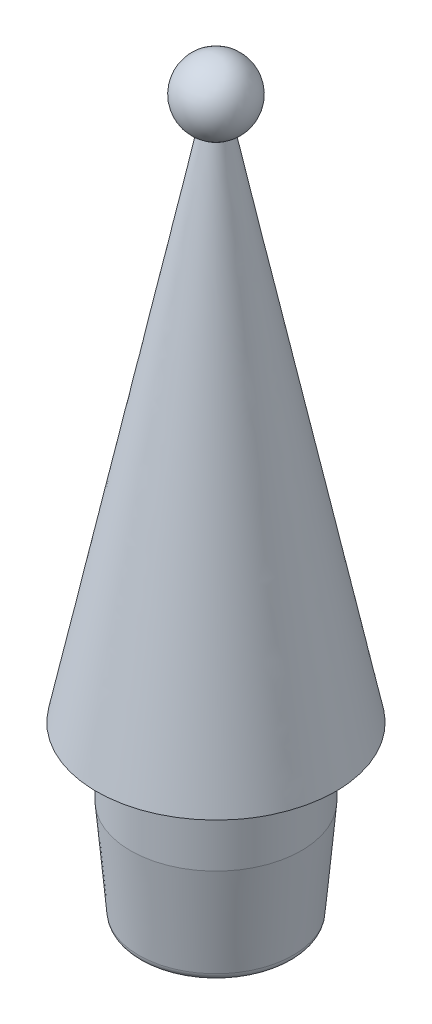
ISO-10303-21;
HEADER;
FILE_DESCRIPTION(('STEP AP214'),'2;1');
FILE_NAME('part.step','',(''),(''),'','','');
FILE_SCHEMA(('AUTOMOTIVE_DESIGN { 1 0 10303 214 1 1 1 1 }'));
ENDSEC;
DATA;
#1=APPLICATION_CONTEXT('core data for automotive mechanical design processes');
#2=APPLICATION_PROTOCOL_DEFINITION('international standard','automotive_design',2000,#1);
#3=PRODUCT_CONTEXT('',#1,'mechanical');
#4=PRODUCT('Part','Part','',(#3));
#5=PRODUCT_RELATED_PRODUCT_CATEGORY('part','',(#4));
#6=PRODUCT_DEFINITION_FORMATION('','',#4);
#7=PRODUCT_DEFINITION_CONTEXT('part definition',#1,'design');
#8=PRODUCT_DEFINITION('design','',#6,#7);
#9=PRODUCT_DEFINITION_SHAPE('','',#8);
#10=(LENGTH_UNIT() NAMED_UNIT(*) SI_UNIT(.MILLI.,.METRE.));
#11=(NAMED_UNIT(*) PLANE_ANGLE_UNIT() SI_UNIT($,.RADIAN.));
#12=(NAMED_UNIT(*) SI_UNIT($,.STERADIAN.) SOLID_ANGLE_UNIT());
#13=UNCERTAINTY_MEASURE_WITH_UNIT(LENGTH_MEASURE(1.E-05),#10,'distance_accuracy_value','');
#14=(GEOMETRIC_REPRESENTATION_CONTEXT(3) GLOBAL_UNCERTAINTY_ASSIGNED_CONTEXT((#13)) GLOBAL_UNIT_ASSIGNED_CONTEXT((#10,
#11,#12)) REPRESENTATION_CONTEXT('',''));
#15=CARTESIAN_POINT('',(0.,0.,0.));
#16=DIRECTION('',(0.,0.,1.));
#17=DIRECTION('',(1.,0.,0.));
#18=AXIS2_PLACEMENT_3D('',#15,#16,#17);
#19=CARTESIAN_POINT('',(0.,5.,0.));
#20=DIRECTION('',(0.,-1.,0.));
#21=DIRECTION('',(0.,0.,-1.));
#22=AXIS2_PLACEMENT_3D('',#19,#20,#21);
#23=CYLINDRICAL_SURFACE('',#22,2.5);
#24=CARTESIAN_POINT('',(0.,4.75,0.));
#25=DIRECTION('',(0.,1.,0.));
#26=DIRECTION('',(0.,0.,1.));
#27=AXIS2_PLACEMENT_3D('',#24,#25,#26);
#28=CIRCLE('',#27,2.5);
#29=CARTESIAN_POINT('',(0.,4.75,2.5));
#30=VERTEX_POINT('',#29);
#31=EDGE_CURVE('E65',#30,#30,#28,.F.);
#32=ORIENTED_EDGE('',*,*,#31,.T.);
#33=EDGE_LOOP('',(#32));
#34=FACE_BOUND('',#33,.T.);
#35=CARTESIAN_POINT('',(0.,3.00000000000018,0.));
#36=DIRECTION('',(0.,1.,0.));
#37=DIRECTION('',(0.,0.,1.));
#38=AXIS2_PLACEMENT_3D('',#35,#36,#37);
#39=CIRCLE('',#38,2.5);
#40=CARTESIAN_POINT('',(0.,3.00000000000018,2.5));
#41=VERTEX_POINT('',#40);
#42=EDGE_CURVE('E71',#41,#41,#39,.T.);
#43=ORIENTED_EDGE('',*,*,#42,.T.);
#44=EDGE_LOOP('',(#43));
#45=FACE_BOUND('',#44,.T.);
#46=ADVANCED_FACE('F39',(#34,#45),#23,.T.);
#47=CARTESIAN_POINT('',(0.,0.,0.));
#48=DIRECTION('',(0.,1.,0.));
#49=DIRECTION('',(0.,0.,1.));
#50=AXIS2_PLACEMENT_3D('',#47,#48,#49);
#51=PLANE('',#50);
#52=CARTESIAN_POINT('',(0.,0.,0.));
#53=DIRECTION('',(0.,1.,0.));
#54=DIRECTION('',(0.,0.,1.));
#55=AXIS2_PLACEMENT_3D('',#52,#53,#54);
#56=CIRCLE('',#55,1.61642219370202);
#57=CARTESIAN_POINT('',(0.,0.,1.61642219370202));
#58=VERTEX_POINT('',#57);
#59=EDGE_CURVE('E59',#58,#58,#56,.T.);
#60=ORIENTED_EDGE('',*,*,#59,.T.);
#61=EDGE_LOOP('',(#60));
#62=FACE_BOUND('',#61,.T.);
#63=CARTESIAN_POINT('',(0.,0.,0.));
#64=DIRECTION('',(0.,1.,0.));
#65=DIRECTION('',(0.,0.,1.));
#66=AXIS2_PLACEMENT_3D('',#63,#64,#65);
#67=CIRCLE('',#66,2.00845121591786);
#68=CARTESIAN_POINT('',(0.,0.,2.00845121591786));
#69=VERTEX_POINT('',#68);
#70=EDGE_CURVE('E62',#69,#69,#67,.F.);
#71=ORIENTED_EDGE('',*,*,#70,.T.);
#72=EDGE_LOOP('',(#71));
#73=FACE_BOUND('',#72,.T.);
#74=ADVANCED_FACE('F105',(#62,#73),#51,.F.);
#75=CARTESIAN_POINT('',(0.,5.,0.));
#76=DIRECTION('',(0.,1.,0.));
#77=DIRECTION('',(0.,0.,1.));
#78=AXIS2_PLACEMENT_3D('',#75,#76,#77);
#79=PLANE('',#78);
#80=CARTESIAN_POINT('',(0.,5.,0.));
#81=DIRECTION('',(0.,1.,0.));
#82=DIRECTION('',(0.,0.,1.));
#83=AXIS2_PLACEMENT_3D('',#80,#81,#82);
#84=CIRCLE('',#83,2.75);
#85=CARTESIAN_POINT('',(0.,5.,2.75));
#86=VERTEX_POINT('',#85);
#87=EDGE_CURVE('E68',#86,#86,#84,.T.);
#88=ORIENTED_EDGE('',*,*,#87,.T.);
#89=EDGE_LOOP('',(#88));
#90=FACE_BOUND('',#89,.T.);
#91=CARTESIAN_POINT('',(0.,5.,0.));
#92=DIRECTION('',(0.,1.,0.));
#93=DIRECTION('',(0.,0.,1.));
#94=AXIS2_PLACEMENT_3D('',#91,#92,#93);
#95=CIRCLE('',#94,3.5);
#96=CARTESIAN_POINT('',(-3.36347141619186,5.,-0.9680186116291));
#97=VERTEX_POINT('',#96);
#98=EDGE_CURVE('E77',#97,#97,#95,.T.);
#99=ORIENTED_EDGE('',*,*,#98,.F.);
#100=EDGE_LOOP('',(#99));
#101=FACE_BOUND('',#100,.T.);
#102=ADVANCED_FACE('F111',(#90,#101),#79,.F.);
#103=CARTESIAN_POINT('',(-0.353623785837754,20.,-0.18694977424371));
#104=CARTESIAN_POINT('',(-3.36347141619186,5.,-0.9680186116291));
#105=CARTESIAN_POINT('',(0.0202757626496648,20.,-0.894197345919219));
#106=CARTESIAN_POINT('',(-1.42743419293366,5.,-7.69496144401282));
#107=CARTESIAN_POINT('',(0.727523334325174,20.,-0.520297797431799));
#108=CARTESIAN_POINT('',(5.29950863945006,5.,-5.75892422075462));
#109=CARTESIAN_POINT('',(0.353623785837755,20.,0.18694977424371));
#110=CARTESIAN_POINT('',(3.36347141619186,5.,0.9680186116291));
#111=CARTESIAN_POINT('',(-0.0202757626496647,20.,0.894197345919219));
#112=CARTESIAN_POINT('',(1.42743419293366,5.,7.69496144401282));
#113=CARTESIAN_POINT('',(-0.727523334325174,20.,0.520297797431799));
#114=CARTESIAN_POINT('',(-5.29950863945006,5.,5.75892422075462));
#115=CARTESIAN_POINT('',(-0.353623785837754,20.,-0.18694977424371));
#116=CARTESIAN_POINT('',(-3.36347141619186,5.,-0.9680186116291));
#117=(BOUNDED_SURFACE() B_SPLINE_SURFACE(3,1,((#103,#104),(#105,#106),(#107,#108),(#109,#110),
(#111,#112),(#113,#114),(#115,#116)),.UNSPECIFIED.,.T.,.F.,.F.) B_SPLINE_SURFACE_WITH_KNOTS((4,
3,4),(2,2),(0.,0.5,1.),(0.,1.),
.UNSPECIFIED.) GEOMETRIC_REPRESENTATION_ITEM() RATIONAL_B_SPLINE_SURFACE(((1.,1.),
(0.333333333333333,0.333333333333333),(0.333333333333333,0.333333333333333),(1.,1.),
(0.333333333333333,0.333333333333333),(0.333333333333333,0.333333333333333),(1.,1.))) REPRESENTATION_ITEM('') SURFACE());
#118=CARTESIAN_POINT('',(0.,20.,0.));
#119=DIRECTION('',(0.,1.,0.));
#120=DIRECTION('',(0.,0.,1.));
#121=AXIS2_PLACEMENT_3D('',#118,#119,#120);
#122=CIRCLE('',#121,0.4);
#123=CARTESIAN_POINT('',(-0.353623785837754,20.,-0.18694977424371));
#124=VERTEX_POINT('',#123);
#125=EDGE_CURVE('E80',#124,#124,#122,.T.);
#126=CARTESIAN_POINT('',(-0.353623785837754,20.,-0.18694977424371));
#127=CARTESIAN_POINT('',(-0.38497636532061,19.84375,-0.195085907966474));
#128=CARTESIAN_POINT('',(-0.416328944803465,19.6875,-0.203222041689239));
#129=CARTESIAN_POINT('',(-0.479034103769175,19.375,-0.219494309134768));
#130=CARTESIAN_POINT('',(-0.510386683252031,19.21875,-0.227630442857532));
#131=CARTESIAN_POINT('',(-0.573091842217741,18.90625,-0.243902710303061));
#132=CARTESIAN_POINT('',(-0.604444421700596,18.75,-0.252038844025825));
#133=CARTESIAN_POINT('',(-0.667149580666307,18.4375,-0.268311111471354));
#134=CARTESIAN_POINT('',(-0.698502160149162,18.28125,-0.276447245194119));
#135=CARTESIAN_POINT('',(-0.761207319114873,17.96875,-0.292719512639648));
#136=CARTESIAN_POINT('',(-0.792559898597728,17.8125,-0.300855646362412));
#137=CARTESIAN_POINT('',(-0.855265057563439,17.5,-0.317127913807941));
#138=CARTESIAN_POINT('',(-0.886617637046294,17.34375,-0.325264047530706));
#139=CARTESIAN_POINT('',(-0.949322796012004,17.03125,-0.341536314976235));
#140=CARTESIAN_POINT('',(-0.98067537549486,16.875,-0.349672448698999));
#141=CARTESIAN_POINT('',(-1.04338053446057,16.5625,-0.365944716144528));
#142=CARTESIAN_POINT('',(-1.07473311394343,16.40625,-0.374080849867293));
#143=CARTESIAN_POINT('',(-1.13743827290914,16.09375,-0.390353117312822));
#144=CARTESIAN_POINT('',(-1.16879085239199,15.9375,-0.398489251035586));
#145=CARTESIAN_POINT('',(-1.2314960113577,15.625,-0.414761518481115));
#146=CARTESIAN_POINT('',(-1.26284859084056,15.46875,-0.42289765220388));
#147=CARTESIAN_POINT('',(-1.32555374980627,15.15625,-0.439169919649409));
#148=CARTESIAN_POINT('',(-1.35690632928912,15.,-0.447306053372173));
#149=CARTESIAN_POINT('',(-1.41961148825483,14.6875,-0.463578320817702));
#150=CARTESIAN_POINT('',(-1.45096406773769,14.53125,-0.471714454540467));
#151=CARTESIAN_POINT('',(-1.5136692267034,14.21875,-0.487986721985996));
#152=CARTESIAN_POINT('',(-1.54502180618625,14.0625,-0.49612285570876));
#153=CARTESIAN_POINT('',(-1.60772696515196,13.75,-0.512395123154289));
#154=CARTESIAN_POINT('',(-1.63907954463482,13.59375,-0.520531256877053));
#155=CARTESIAN_POINT('',(-1.70178470360053,13.28125,-0.536803524322582));
#156=CARTESIAN_POINT('',(-1.73313728308339,13.125,-0.544939658045347));
#157=CARTESIAN_POINT('',(-1.7958424420491,12.8125,-0.561211925490876));
#158=CARTESIAN_POINT('',(-1.82719502153195,12.65625,-0.56934805921364));
#159=CARTESIAN_POINT('',(-1.88990018049766,12.34375,-0.585620326659169));
#160=CARTESIAN_POINT('',(-1.92125275998052,12.1875,-0.593756460381934));
#161=CARTESIAN_POINT('',(-1.98395791894623,11.875,-0.610028727827463));
#162=CARTESIAN_POINT('',(-2.01531049842908,11.71875,-0.618164861550227));
#163=CARTESIAN_POINT('',(-2.07801565739479,11.40625,-0.634437128995756));
#164=CARTESIAN_POINT('',(-2.10936823687765,11.25,-0.642573262718521));
#165=CARTESIAN_POINT('',(-2.17207339584336,10.9375,-0.65884553016405));
#166=CARTESIAN_POINT('',(-2.20342597532621,10.78125,-0.666981663886814));
#167=CARTESIAN_POINT('',(-2.26613113429192,10.46875,-0.683253931332343));
#168=CARTESIAN_POINT('',(-2.29748371377478,10.3125,-0.691390065055108));
#169=CARTESIAN_POINT('',(-2.36018887274049,10.,-0.707662332500637));
#170=CARTESIAN_POINT('',(-2.39154145222335,9.84375,-0.715798466223401));
#171=CARTESIAN_POINT('',(-2.45424661118906,9.53125,-0.73207073366893));
#172=CARTESIAN_POINT('',(-2.48559919067191,9.375,-0.740206867391695));
#173=CARTESIAN_POINT('',(-2.54830434963762,9.0625,-0.756479134837223));
#174=CARTESIAN_POINT('',(-2.57965692912048,8.90625,-0.764615268559988));
#175=CARTESIAN_POINT('',(-2.64236208808619,8.59375,-0.780887536005517));
#176=CARTESIAN_POINT('',(-2.67371466756904,8.4375,-0.789023669728281));
#177=CARTESIAN_POINT('',(-2.73641982653475,8.125,-0.80529593717381));
#178=CARTESIAN_POINT('',(-2.76777240601761,7.96875,-0.813432070896575));
#179=CARTESIAN_POINT('',(-2.83047756498332,7.65625,-0.829704338342104));
#180=CARTESIAN_POINT('',(-2.86183014446617,7.5,-0.837840472064868));
#181=CARTESIAN_POINT('',(-2.92453530343189,7.1875,-0.854112739510397));
#182=CARTESIAN_POINT('',(-2.95588788291474,7.03125,-0.862248873233162));
#183=CARTESIAN_POINT('',(-3.01859304188045,6.71875,-0.878521140678691));
#184=CARTESIAN_POINT('',(-3.04994562136331,6.5625,-0.886657274401455));
#185=CARTESIAN_POINT('',(-3.11265078032902,6.25,-0.902929541846984));
#186=CARTESIAN_POINT('',(-3.14400335981187,6.09375,-0.911065675569749));
#187=CARTESIAN_POINT('',(-3.20670851877758,5.78125,-0.927337943015278));
#188=CARTESIAN_POINT('',(-3.23806109826044,5.625,-0.935474076738042));
#189=CARTESIAN_POINT('',(-3.30076625722615,5.3125,-0.951746344183571));
#190=CARTESIAN_POINT('',(-3.332118836709,5.15625,-0.959882477906336));
#191=CARTESIAN_POINT('',(-3.36347141619186,5.,-0.9680186116291));
#192=B_SPLINE_CURVE_WITH_KNOTS('',3,(#126,#127,#128,#129,#130,#131,#132,#133,#134,#135,#136,
#137,#138,#139,#140,#141,#142,#143,#144,#145,#146,#147,#148,#149,#150,#151,#152,#153,#154,#155,
#156,#157,#158,#159,#160,#161,#162,#163,#164,#165,#166,#167,#168,#169,#170,#171,#172,#173,#174,
#175,#176,#177,#178,#179,#180,#181,#182,#183,#184,#185,#186,#187,#188,#189,#190,#191),
.UNSPECIFIED.,.F.,.F.,(4,2,2,2,2,2,2,2,2,2,2,2,2,2,2,2,2,2,2,2,2,2,2,2,2,2,2,2,2,2,2,2,4),(0.,
0.478716190147828,0.957432380295656,1.43614857044348,1.91486476059131,2.39358095073914,
2.87229714088697,3.35101333103479,3.82972952118262,4.30844571133045,4.78716190147828,
5.2658780916261,5.74459428177393,6.22331047192176,6.70202666206959,7.18074285221741,
7.65945904236524,8.13817523251307,8.6168914226609,9.09560761280873,9.57432380295656,
10.0530399931044,10.5317561832522,11.0104723734,11.4891885635479,11.9679047536957,
12.4466209438435,12.9253371339914,13.4040533241392,13.882769514287,14.3614857044348,
14.8402018945827,15.3189180847305),.UNSPECIFIED.);
#193=EDGE_CURVE('BSEAM156',#124,#97,#192,.T.);
#194=ORIENTED_EDGE('',*,*,#125,.F.);
#195=ORIENTED_EDGE('',*,*,#98,.T.);
#196=ORIENTED_EDGE('',*,*,#193,.T.);
#197=ORIENTED_EDGE('',*,*,#193,.F.);
#198=EDGE_LOOP('',(#194,#196,#195,#197));
#199=FACE_BOUND('',#198,.T.);
#200=ADVANCED_FACE('F156',(#199),#117,.T.);
#201=CARTESIAN_POINT('',(0.,13.,0.));
#202=DIRECTION('',(0.,-1.,0.));
#203=DIRECTION('',(0.,0.,-1.));
#204=AXIS2_PLACEMENT_3D('',#201,#202,#203);
#205=CYLINDRICAL_SURFACE('',#204,1.075);
#206=CARTESIAN_POINT('',(0.,8.59087598488179,0.));
#207=DIRECTION('',(0.,1.,0.));
#208=DIRECTION('',(0.,0.,1.));
#209=AXIS2_PLACEMENT_3D('',#206,#207,#208);
#210=CIRCLE('',#209,1.075);
#211=CARTESIAN_POINT('',(0.,8.59087598488179,-1.075));
#212=VERTEX_POINT('',#211);
#213=EDGE_CURVE('E74',#212,#212,#210,.F.);
#214=CARTESIAN_POINT('',(0.,13.,0.));
#215=DIRECTION('',(0.,1.,0.));
#216=DIRECTION('',(0.,0.,1.));
#217=AXIS2_PLACEMENT_3D('',#214,#215,#216);
#218=CIRCLE('',#217,1.075);
#219=CARTESIAN_POINT('',(0.,13.,-1.075));
#220=VERTEX_POINT('',#219);
#221=EDGE_CURVE('E83',#220,#220,#218,.T.);
#222=CARTESIAN_POINT('',(0.,8.59087598488179,-1.075));
#223=CARTESIAN_POINT('',(0.,8.63680436003927,-1.075));
#224=CARTESIAN_POINT('',(0.,8.68273273519675,-1.075));
#225=CARTESIAN_POINT('',(0.,8.77458948551171,-1.075));
#226=CARTESIAN_POINT('',(0.,8.82051786066919,-1.075));
#227=CARTESIAN_POINT('',(0.,8.91237461098415,-1.075));
#228=CARTESIAN_POINT('',(0.,8.95830298614164,-1.075));
#229=CARTESIAN_POINT('',(0.,9.0501597364566,-1.075));
#230=CARTESIAN_POINT('',(0.,9.09608811161408,-1.075));
#231=CARTESIAN_POINT('',(0.,9.18794486192904,-1.075));
#232=CARTESIAN_POINT('',(0.,9.23387323708652,-1.075));
#233=CARTESIAN_POINT('',(0.,9.32572998740149,-1.075));
#234=CARTESIAN_POINT('',(0.,9.37165836255897,-1.075));
#235=CARTESIAN_POINT('',(0.,9.46351511287393,-1.075));
#236=CARTESIAN_POINT('',(0.,9.50944348803141,-1.075));
#237=CARTESIAN_POINT('',(0.,9.60130023834638,-1.075));
#238=CARTESIAN_POINT('',(0.,9.64722861350386,-1.075));
#239=CARTESIAN_POINT('',(0.,9.73908536381882,-1.075));
#240=CARTESIAN_POINT('',(0.,9.7850137389763,-1.075));
#241=CARTESIAN_POINT('',(0.,9.87687048929126,-1.075));
#242=CARTESIAN_POINT('',(0.,9.92279886444874,-1.075));
#243=CARTESIAN_POINT('',(0.,10.0146556147637,-1.075));
#244=CARTESIAN_POINT('',(0.,10.0605839899212,-1.075));
#245=CARTESIAN_POINT('',(0.,10.1524407402362,-1.075));
#246=CARTESIAN_POINT('',(0.,10.1983691153936,-1.075));
#247=CARTESIAN_POINT('',(0.,10.2902258657086,-1.075));
#248=CARTESIAN_POINT('',(0.,10.3361542408661,-1.075));
#249=CARTESIAN_POINT('',(0.,10.428010991181,-1.075));
#250=CARTESIAN_POINT('',(0.,10.4739393663385,-1.075));
#251=CARTESIAN_POINT('',(0.,10.5657961166535,-1.075));
#252=CARTESIAN_POINT('',(0.,10.611724491811,-1.075));
#253=CARTESIAN_POINT('',(0.,10.7035812421259,-1.075));
#254=CARTESIAN_POINT('',(0.,10.7495096172834,-1.075));
#255=CARTESIAN_POINT('',(0.,10.8413663675984,-1.075));
#256=CARTESIAN_POINT('',(0.,10.8872947427559,-1.075));
#257=CARTESIAN_POINT('',(0.,10.9791514930708,-1.075));
#258=CARTESIAN_POINT('',(0.,11.0250798682283,-1.075));
#259=CARTESIAN_POINT('',(0.,11.1169366185433,-1.075));
#260=CARTESIAN_POINT('',(0.,11.1628649937007,-1.075));
#261=CARTESIAN_POINT('',(0.,11.2547217440157,-1.075));
#262=CARTESIAN_POINT('',(0.,11.3006501191732,-1.075));
#263=CARTESIAN_POINT('',(0.,11.3925068694881,-1.075));
#264=CARTESIAN_POINT('',(0.,11.4384352446456,-1.075));
#265=CARTESIAN_POINT('',(0.,11.5302919949606,-1.075));
#266=CARTESIAN_POINT('',(0.,11.5762203701181,-1.075));
#267=CARTESIAN_POINT('',(0.,11.668077120433,-1.075));
#268=CARTESIAN_POINT('',(0.,11.7140054955905,-1.075));
#269=CARTESIAN_POINT('',(0.,11.8058622459055,-1.075));
#270=CARTESIAN_POINT('',(0.,11.851790621063,-1.075));
#271=CARTESIAN_POINT('',(0.,11.9436473713779,-1.075));
#272=CARTESIAN_POINT('',(0.,11.9895757465354,-1.075));
#273=CARTESIAN_POINT('',(0.,12.0814324968504,-1.075));
#274=CARTESIAN_POINT('',(0.,12.1273608720079,-1.075));
#275=CARTESIAN_POINT('',(0.,12.2192176223228,-1.075));
#276=CARTESIAN_POINT('',(0.,12.2651459974803,-1.075));
#277=CARTESIAN_POINT('',(0.,12.3570027477953,-1.075));
#278=CARTESIAN_POINT('',(0.,12.4029311229527,-1.075));
#279=CARTESIAN_POINT('',(0.,12.4947878732677,-1.075));
#280=CARTESIAN_POINT('',(0.,12.5407162484252,-1.075));
#281=CARTESIAN_POINT('',(0.,12.6325729987401,-1.075));
#282=CARTESIAN_POINT('',(0.,12.6785013738976,-1.075));
#283=CARTESIAN_POINT('',(0.,12.7703581242126,-1.075));
#284=CARTESIAN_POINT('',(0.,12.8162864993701,-1.075));
#285=CARTESIAN_POINT('',(0.,12.908143249685,-1.075));
#286=CARTESIAN_POINT('',(0.,12.9540716248425,-1.075));
#287=CARTESIAN_POINT('',(0.,13.,-1.075));
#288=B_SPLINE_CURVE_WITH_KNOTS('',3,(#222,#223,#224,#225,#226,#227,#228,#229,#230,#231,#232,
#233,#234,#235,#236,#237,#238,#239,#240,#241,#242,#243,#244,#245,#246,#247,#248,#249,#250,#251,
#252,#253,#254,#255,#256,#257,#258,#259,#260,#261,#262,#263,#264,#265,#266,#267,#268,#269,#270,
#271,#272,#273,#274,#275,#276,#277,#278,#279,#280,#281,#282,#283,#284,#285,#286,#287),
.UNSPECIFIED.,.F.,.F.,(4,2,2,2,2,2,2,2,2,2,2,2,2,2,2,2,2,2,2,2,2,2,2,2,2,2,2,2,2,2,2,2,4),(0.,
0.137785125472443,0.275570250944887,0.413355376417332,0.551140501889775,0.688925627362219,
0.826710752834664,0.964495878307109,1.10228100377955,1.240066129252,1.37785125472444,
1.51563638019689,1.65342150566933,1.79120663114177,1.92899175661422,2.06677688208666,
2.20456200755911,2.34234713303155,2.48013225850399,2.61791738397644,2.75570250944888,
2.89348763492133,3.03127276039377,3.16905788586622,3.30684301133866,3.4446281368111,
3.58241326228355,3.72019838775599,3.85798351322844,3.99576863870088,4.13355376417333,
4.27133888964577,4.40912401511821),.UNSPECIFIED.);
#289=EDGE_CURVE('BSEAM171',#212,#220,#288,.T.);
#290=ORIENTED_EDGE('',*,*,#213,.T.);
#291=ORIENTED_EDGE('',*,*,#221,.T.);
#292=ORIENTED_EDGE('',*,*,#289,.T.);
#293=ORIENTED_EDGE('',*,*,#289,.F.);
#294=EDGE_LOOP('',(#290,#292,#291,#293));
#295=FACE_BOUND('',#294,.T.);
#296=ADVANCED_FACE('F171',(#295),#205,.F.);
#297=CARTESIAN_POINT('',(0.,13.,0.));
#298=DIRECTION('',(0.,1.,0.));
#299=DIRECTION('',(0.,0.,1.));
#300=AXIS2_PLACEMENT_3D('',#297,#298,#299);
#301=PLANE('',#300);
#302=CARTESIAN_POINT('',(0.,13.,0.));
#303=DIRECTION('',(0.,1.,0.));
#304=DIRECTION('',(0.,0.,1.));
#305=AXIS2_PLACEMENT_3D('',#302,#303,#304);
#306=CIRCLE('',#305,0.65);
#307=CARTESIAN_POINT('',(0.,13.,0.65));
#308=VERTEX_POINT('',#307);
#309=EDGE_CURVE('E11',#308,#308,#306,.T.);
#310=ORIENTED_EDGE('',*,*,#309,.T.);
#311=EDGE_LOOP('',(#310));
#312=FACE_BOUND('',#311,.T.);
#313=ORIENTED_EDGE('',*,*,#221,.F.);
#314=EDGE_LOOP('',(#313));
#315=FACE_BOUND('',#314,.T.);
#316=ADVANCED_FACE('F121',(#312,#315),#301,.F.);
#317=CARTESIAN_POINT('',(0.,0.,0.));
#318=DIRECTION('',(0.,-1.,0.));
#319=DIRECTION('',(0.,0.,-1.));
#320=AXIS2_PLACEMENT_3D('',#317,#318,#319);
#321=CONICAL_SURFACE('',#320,1.37500000000025,0.0349065850398873);
#322=CARTESIAN_POINT('',(0.,0.241275125824375,0.));
#323=DIRECTION('',(0.,-1.,0.));
#324=DIRECTION('',(0.,0.,-1.));
#325=AXIS2_PLACEMENT_3D('',#322,#323,#324);
#326=CIRCLE('',#325,1.36657448694725);
#327=CARTESIAN_POINT('',(0.,0.241275125824375,-1.36657448694725));
#328=VERTEX_POINT('',#327);
#329=EDGE_CURVE('E54',#328,#328,#326,.T.);
#330=ORIENTED_EDGE('',*,*,#329,.T.);
#331=EDGE_LOOP('',(#330));
#332=FACE_BOUND('',#331,.T.);
#333=ORIENTED_EDGE('',*,*,#213,.F.);
#334=EDGE_LOOP('',(#333));
#335=FACE_BOUND('',#334,.T.);
#336=ADVANCED_FACE('F117',(#332,#335),#321,.F.);
#337=CARTESIAN_POINT('',(0.,3.00000000000018,0.));
#338=DIRECTION('',(0.,1.,0.));
#339=DIRECTION('',(0.,0.,1.));
#340=AXIS2_PLACEMENT_3D('',#337,#338,#339);
#341=CONICAL_SURFACE('',#340,2.5,0.087266462599714);
#342=CARTESIAN_POINT('',(0.,0.228211064313086,0.));
#343=DIRECTION('',(0.,1.,0.));
#344=DIRECTION('',(0.,0.,1.));
#345=AXIS2_PLACEMENT_3D('',#342,#343,#344);
#346=CIRCLE('',#345,2.2574998904408);
#347=CARTESIAN_POINT('',(0.,0.228211064313086,2.2574998904408));
#348=VERTEX_POINT('',#347);
#349=EDGE_CURVE('E50',#348,#348,#346,.T.);
#350=ORIENTED_EDGE('',*,*,#349,.T.);
#351=EDGE_LOOP('',(#350));
#352=FACE_BOUND('',#351,.T.);
#353=ORIENTED_EDGE('',*,*,#42,.F.);
#354=EDGE_LOOP('',(#353));
#355=FACE_BOUND('',#354,.T.);
#356=ADVANCED_FACE('F120',(#352,#355),#341,.T.);
#357=CARTESIAN_POINT('',(0.,4.75,0.));
#358=DIRECTION('',(0.,1.,0.));
#359=DIRECTION('',(0.,0.,1.));
#360=AXIS2_PLACEMENT_3D('',#357,#358,#359);
#361=TOROIDAL_SURFACE('',#360,2.75,0.25);
#362=ORIENTED_EDGE('',*,*,#31,.F.);
#363=EDGE_LOOP('',(#362));
#364=FACE_BOUND('',#363,.T.);
#365=ORIENTED_EDGE('',*,*,#87,.F.);
#366=EDGE_LOOP('',(#365));
#367=FACE_BOUND('',#366,.T.);
#368=ADVANCED_FACE('F125',(#364,#367),#361,.F.);
#369=CARTESIAN_POINT('',(0.,0.25,0.));
#370=DIRECTION('',(0.,1.,0.));
#371=DIRECTION('',(0.,0.,1.));
#372=AXIS2_PLACEMENT_3D('',#369,#370,#371);
#373=TOROIDAL_SURFACE('',#372,1.61642219370202,0.25);
#374=ORIENTED_EDGE('',*,*,#329,.F.);
#375=EDGE_LOOP('',(#374));
#376=FACE_BOUND('',#375,.T.);
#377=ORIENTED_EDGE('',*,*,#59,.F.);
#378=EDGE_LOOP('',(#377));
#379=FACE_BOUND('',#378,.T.);
#380=ADVANCED_FACE('F129',(#376,#379),#373,.T.);
#381=CARTESIAN_POINT('',(0.,0.25,0.));
#382=DIRECTION('',(0.,1.,0.));
#383=DIRECTION('',(0.,0.,1.));
#384=AXIS2_PLACEMENT_3D('',#381,#382,#383);
#385=TOROIDAL_SURFACE('',#384,2.00845121591786,0.25);
#386=ORIENTED_EDGE('',*,*,#349,.F.);
#387=EDGE_LOOP('',(#386));
#388=FACE_BOUND('',#387,.T.);
#389=ORIENTED_EDGE('',*,*,#70,.F.);
#390=EDGE_LOOP('',(#389));
#391=FACE_BOUND('',#390,.T.);
#392=ADVANCED_FACE('F101',(#388,#391),#385,.T.);
#393=CARTESIAN_POINT('',(0.,20.9165151389912,0.));
#394=DIRECTION('',(0.,1.,0.));
#395=DIRECTION('',(-1.,0.,0.));
#396=AXIS2_PLACEMENT_3D('',#393,#394,#395);
#397=SPHERICAL_SURFACE('',#396,1.);
#398=ORIENTED_EDGE('',*,*,#125,.T.);
#399=EDGE_LOOP('',(#398));
#400=FACE_BOUND('',#399,.T.);
#401=ADVANCED_FACE('F94',(#400),#397,.T.);
#402=CARTESIAN_POINT('',(0.,17.,0.));
#403=DIRECTION('',(0.,-1.,0.));
#404=DIRECTION('',(0.,0.,-1.));
#405=AXIS2_PLACEMENT_3D('',#402,#403,#404);
#406=CYLINDRICAL_SURFACE('',#405,0.55);
#407=CARTESIAN_POINT('',(0.,13.1,0.));
#408=DIRECTION('',(0.,1.,0.));
#409=DIRECTION('',(0.,0.,1.));
#410=AXIS2_PLACEMENT_3D('',#407,#408,#409);
#411=CIRCLE('',#410,0.55);
#412=CARTESIAN_POINT('',(0.,13.1,0.55));
#413=VERTEX_POINT('',#412);
#414=EDGE_CURVE('E46',#413,#413,#411,.F.);
#415=ORIENTED_EDGE('',*,*,#414,.T.);
#416=EDGE_LOOP('',(#415));
#417=FACE_BOUND('',#416,.T.);
#418=CARTESIAN_POINT('',(0.,17.,0.));
#419=DIRECTION('',(0.,-1.,0.));
#420=DIRECTION('',(0.,0.,-1.));
#421=AXIS2_PLACEMENT_3D('',#418,#419,#420);
#422=CIRCLE('',#421,0.55);
#423=CARTESIAN_POINT('',(0.,17.,-0.55));
#424=VERTEX_POINT('',#423);
#425=EDGE_CURVE('E86',#424,#424,#422,.T.);
#426=ORIENTED_EDGE('',*,*,#425,.F.);
#427=EDGE_LOOP('',(#426));
#428=FACE_BOUND('',#427,.T.);
#429=ADVANCED_FACE('F92',(#417,#428),#406,.F.);
#430=CARTESIAN_POINT('',(0.,17.,0.));
#431=DIRECTION('',(0.,-1.,0.));
#432=DIRECTION('',(0.,0.,-1.));
#433=AXIS2_PLACEMENT_3D('',#430,#431,#432);
#434=PLANE('',#433);
#435=ORIENTED_EDGE('',*,*,#425,.T.);
#436=EDGE_LOOP('',(#435));
#437=FACE_BOUND('',#436,.T.);
#438=ADVANCED_FACE('F90',(#437),#434,.T.);
#439=CARTESIAN_POINT('',(0.,13.1,0.));
#440=DIRECTION('',(0.,1.,0.));
#441=DIRECTION('',(0.,0.,1.));
#442=AXIS2_PLACEMENT_3D('',#439,#440,#441);
#443=TOROIDAL_SURFACE('',#442,0.65,0.1);
#444=ORIENTED_EDGE('',*,*,#309,.F.);
#445=EDGE_LOOP('',(#444));
#446=FACE_BOUND('',#445,.T.);
#447=ORIENTED_EDGE('',*,*,#414,.F.);
#448=EDGE_LOOP('',(#447));
#449=FACE_BOUND('',#448,.T.);
#450=ADVANCED_FACE('F41',(#446,#449),#443,.T.);
#451=CLOSED_SHELL('',(#46,#74,#102,#200,#296,#316,#336,#356,#368,#380,#392,#401,#429,#438,#450));
#452=MANIFOLD_SOLID_BREP('B2',#451);
#453=ADVANCED_BREP_SHAPE_REPRESENTATION('',(#18,#452),#14);
#454=SHAPE_DEFINITION_REPRESENTATION(#9,#453);
ENDSEC;
END-ISO-10303-21;
